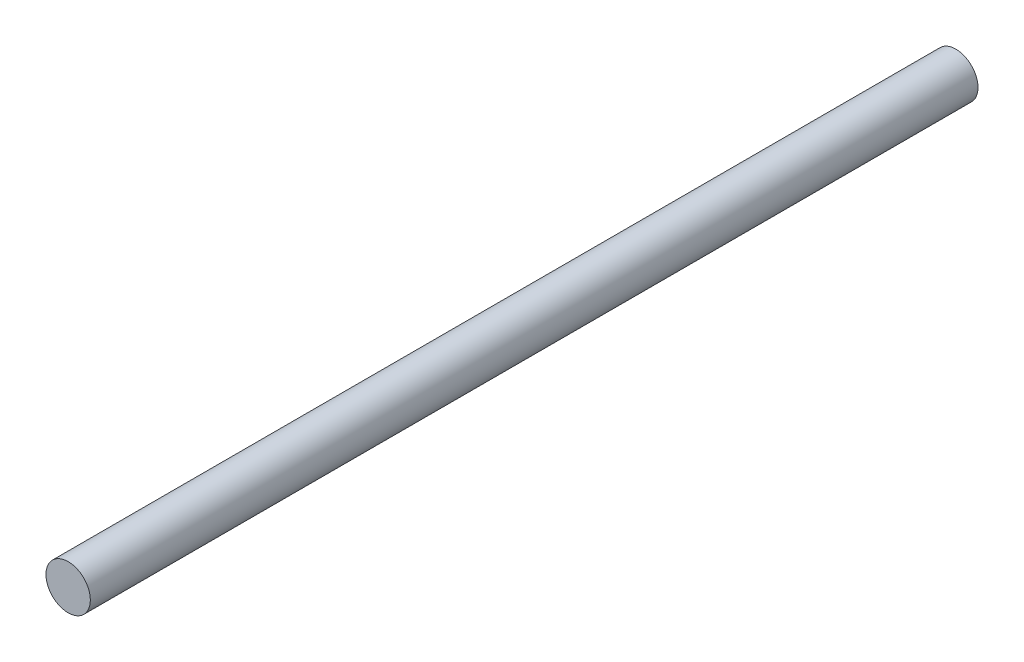
ISO-10303-21;
HEADER;
FILE_DESCRIPTION(('STEP AP214'),'2;1');
FILE_NAME('part.step','',(''),(''),'','','');
FILE_SCHEMA(('AUTOMOTIVE_DESIGN { 1 0 10303 214 1 1 1 1 }'));
ENDSEC;
DATA;
#1=APPLICATION_CONTEXT('core data for automotive mechanical design processes');
#2=APPLICATION_PROTOCOL_DEFINITION('international standard','automotive_design',2000,#1);
#3=PRODUCT_CONTEXT('',#1,'mechanical');
#4=PRODUCT('Part','Part','',(#3));
#5=PRODUCT_RELATED_PRODUCT_CATEGORY('part','',(#4));
#6=PRODUCT_DEFINITION_FORMATION('','',#4);
#7=PRODUCT_DEFINITION_CONTEXT('part definition',#1,'design');
#8=PRODUCT_DEFINITION('design','',#6,#7);
#9=PRODUCT_DEFINITION_SHAPE('','',#8);
#10=(LENGTH_UNIT() NAMED_UNIT(*) SI_UNIT(.MILLI.,.METRE.));
#11=(NAMED_UNIT(*) PLANE_ANGLE_UNIT() SI_UNIT($,.RADIAN.));
#12=(NAMED_UNIT(*) SI_UNIT($,.STERADIAN.) SOLID_ANGLE_UNIT());
#13=UNCERTAINTY_MEASURE_WITH_UNIT(LENGTH_MEASURE(1.E-05),#10,'distance_accuracy_value','');
#14=(GEOMETRIC_REPRESENTATION_CONTEXT(3) GLOBAL_UNCERTAINTY_ASSIGNED_CONTEXT((#13)) GLOBAL_UNIT_ASSIGNED_CONTEXT((#10,
#11,#12)) REPRESENTATION_CONTEXT('',''));
#15=CARTESIAN_POINT('',(0.,0.,0.));
#16=DIRECTION('',(0.,0.,1.));
#17=DIRECTION('',(1.,0.,0.));
#18=AXIS2_PLACEMENT_3D('',#15,#16,#17);
#19=CARTESIAN_POINT('',(0.,0.,2000.));
#20=DIRECTION('',(0.,0.,-1.));
#21=DIRECTION('',(-1.,0.,0.));
#22=AXIS2_PLACEMENT_3D('',#19,#20,#21);
#23=CYLINDRICAL_SURFACE('',#22,50.);
#24=CARTESIAN_POINT('',(0.,0.,2000.));
#25=DIRECTION('',(0.,0.,1.));
#26=DIRECTION('',(1.,0.,0.));
#27=AXIS2_PLACEMENT_3D('',#24,#25,#26);
#28=CIRCLE('',#27,50.);
#29=CARTESIAN_POINT('',(50.,0.,2000.));
#30=VERTEX_POINT('',#29);
#31=EDGE_CURVE('E10',#30,#30,#28,.T.);
#32=ORIENTED_EDGE('',*,*,#31,.F.);
#33=EDGE_LOOP('',(#32));
#34=FACE_BOUND('',#33,.T.);
#35=CARTESIAN_POINT('',(0.,0.,0.));
#36=DIRECTION('',(0.,0.,1.));
#37=DIRECTION('',(1.,0.,0.));
#38=AXIS2_PLACEMENT_3D('',#35,#36,#37);
#39=CIRCLE('',#38,50.);
#40=CARTESIAN_POINT('',(50.,0.,0.));
#41=VERTEX_POINT('',#40);
#42=EDGE_CURVE('E44',#41,#41,#39,.T.);
#43=ORIENTED_EDGE('',*,*,#42,.T.);
#44=EDGE_LOOP('',(#43));
#45=FACE_BOUND('',#44,.T.);
#46=ADVANCED_FACE('F41',(#34,#45),#23,.T.);
#47=CARTESIAN_POINT('',(0.,0.,2000.));
#48=DIRECTION('',(0.,0.,1.));
#49=DIRECTION('',(1.,0.,0.));
#50=AXIS2_PLACEMENT_3D('',#47,#48,#49);
#51=PLANE('',#50);
#52=ORIENTED_EDGE('',*,*,#31,.T.);
#53=EDGE_LOOP('',(#52));
#54=FACE_BOUND('',#53,.T.);
#55=ADVANCED_FACE('F56',(#54),#51,.T.);
#56=CARTESIAN_POINT('',(0.,0.,0.));
#57=DIRECTION('',(0.,0.,1.));
#58=DIRECTION('',(1.,0.,0.));
#59=AXIS2_PLACEMENT_3D('',#56,#57,#58);
#60=PLANE('',#59);
#61=ORIENTED_EDGE('',*,*,#42,.F.);
#62=EDGE_LOOP('',(#61));
#63=FACE_BOUND('',#62,.T.);
#64=ADVANCED_FACE('F54',(#63),#60,.F.);
#65=CLOSED_SHELL('',(#46,#55,#64));
#66=MANIFOLD_SOLID_BREP('B2',#65);
#67=ADVANCED_BREP_SHAPE_REPRESENTATION('',(#18,#66),#14);
#68=SHAPE_DEFINITION_REPRESENTATION(#9,#67);
ENDSEC;
END-ISO-10303-21;
